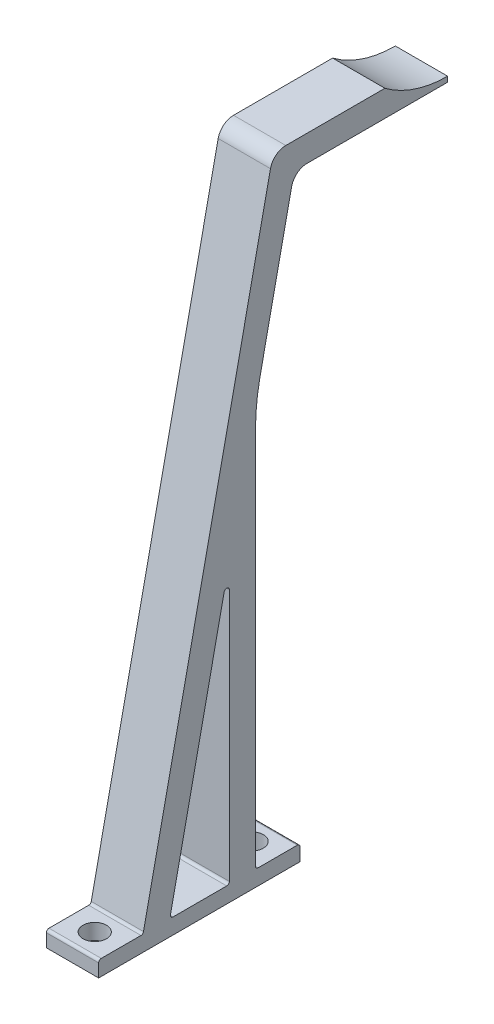
ISO-10303-21;
HEADER;
FILE_DESCRIPTION(('STEP AP214'),'2;1');
FILE_NAME('part.step','',(''),(''),'','','');
FILE_SCHEMA(('AUTOMOTIVE_DESIGN { 1 0 10303 214 1 1 1 1 }'));
ENDSEC;
DATA;
#1=APPLICATION_CONTEXT('core data for automotive mechanical design processes');
#2=APPLICATION_PROTOCOL_DEFINITION('international standard','automotive_design',2000,#1);
#3=PRODUCT_CONTEXT('',#1,'mechanical');
#4=PRODUCT('Part','Part','',(#3));
#5=PRODUCT_RELATED_PRODUCT_CATEGORY('part','',(#4));
#6=PRODUCT_DEFINITION_FORMATION('','',#4);
#7=PRODUCT_DEFINITION_CONTEXT('part definition',#1,'design');
#8=PRODUCT_DEFINITION('design','',#6,#7);
#9=PRODUCT_DEFINITION_SHAPE('','',#8);
#10=(LENGTH_UNIT() NAMED_UNIT(*) SI_UNIT(.MILLI.,.METRE.));
#11=(NAMED_UNIT(*) PLANE_ANGLE_UNIT() SI_UNIT($,.RADIAN.));
#12=(NAMED_UNIT(*) SI_UNIT($,.STERADIAN.) SOLID_ANGLE_UNIT());
#13=UNCERTAINTY_MEASURE_WITH_UNIT(LENGTH_MEASURE(1.E-05),#10,'distance_accuracy_value','');
#14=(GEOMETRIC_REPRESENTATION_CONTEXT(3) GLOBAL_UNCERTAINTY_ASSIGNED_CONTEXT((#13)) GLOBAL_UNIT_ASSIGNED_CONTEXT((#10,
#11,#12)) REPRESENTATION_CONTEXT('',''));
#15=CARTESIAN_POINT('',(0.,0.,0.));
#16=DIRECTION('',(0.,0.,1.));
#17=DIRECTION('',(1.,0.,0.));
#18=AXIS2_PLACEMENT_3D('',#15,#16,#17);
#19=CARTESIAN_POINT('',(10.,104.09497759232,-22.3292773624713));
#20=DIRECTION('',(-1.,0.,0.));
#21=DIRECTION('',(0.,0.,1.));
#22=AXIS2_PLACEMENT_3D('',#19,#20,#21);
#23=PLANE('',#22);
#24=CARTESIAN_POINT('',(10.,104.09497759232,-22.3292773624713));
#25=DIRECTION('',(-1.,0.,0.));
#26=DIRECTION('',(0.,0.,1.));
#27=AXIS2_PLACEMENT_3D('',#24,#25,#26);
#28=CIRCLE('',#27,3.);
#29=CARTESIAN_POINT('',(10.,104.718712664774,-19.3948345602699));
#30=VERTEX_POINT('',#29);
#31=CARTESIAN_POINT('',(10.,107.09497759232,-22.3292773624713));
#32=VERTEX_POINT('',#31);
#33=EDGE_CURVE('E255',#30,#32,#28,.T.);
#34=ORIENTED_EDGE('',*,*,#33,.F.);
#35=DIRECTION('',(0.,-0.978147600733806,0.207911690817756));
#36=VECTOR('',#35,1.);
#37=CARTESIAN_POINT('',(10.,104.718712664774,-19.3948345602699));
#38=LINE('',#37,#36);
#39=CARTESIAN_POINT('',(10.,-9.5089782530885,4.88501066873651));
#40=VERTEX_POINT('',#39);
#41=EDGE_CURVE('E297',#30,#40,#38,.T.);
#42=ORIENTED_EDGE('',*,*,#41,.T.);
#43=CARTESIAN_POINT('',(10.,-9.40502240767963,5.37408446910341));
#44=DIRECTION('',(-1.,0.,0.));
#45=DIRECTION('',(0.,0.,1.));
#46=AXIS2_PLACEMENT_3D('',#43,#44,#45);
#47=CIRCLE('',#46,0.500000000000002);
#48=CARTESIAN_POINT('',(10.,-9.90502240767963,5.37408446910341));
#49=VERTEX_POINT('',#48);
#50=EDGE_CURVE('E295',#40,#49,#47,.T.);
#51=ORIENTED_EDGE('',*,*,#50,.T.);
#52=DIRECTION('',(0.,0.,1.));
#53=VECTOR('',#52,1.);
#54=CARTESIAN_POINT('',(10.,-9.90502240767963,5.37408446910341));
#55=LINE('',#54,#53);
#56=CARTESIAN_POINT('',(10.,-9.90502240767962,12.9691924525059));
#57=VERTEX_POINT('',#56);
#58=EDGE_CURVE('E293',#49,#57,#55,.T.);
#59=ORIENTED_EDGE('',*,*,#58,.T.);
#60=CARTESIAN_POINT('',(10.,-10.4050224076796,12.9691924525059));
#61=DIRECTION('',(1.,0.,0.));
#62=DIRECTION('',(0.,0.,-1.));
#63=AXIS2_PLACEMENT_3D('',#60,#61,#62);
#64=CIRCLE('',#63,0.500000000000001);
#65=CARTESIAN_POINT('',(10.,-10.4050224076796,13.4691924525059));
#66=VERTEX_POINT('',#65);
#67=EDGE_CURVE('E291',#57,#66,#64,.T.);
#68=ORIENTED_EDGE('',*,*,#67,.T.);
#69=DIRECTION('',(0.,-1.,0.));
#70=VECTOR('',#69,1.);
#71=CARTESIAN_POINT('',(10.,-10.4050224076796,13.4691924525059));
#72=LINE('',#71,#70);
#73=CARTESIAN_POINT('',(10.,-12.9050224076796,13.4691924525059));
#74=VERTEX_POINT('',#73);
#75=EDGE_CURVE('E289',#66,#74,#72,.T.);
#76=ORIENTED_EDGE('',*,*,#75,.T.);
#77=DIRECTION('',(0.,0.,-1.));
#78=VECTOR('',#77,1.);
#79=CARTESIAN_POINT('',(10.,-12.9050224076796,13.4691924525059));
#80=LINE('',#79,#78);
#81=CARTESIAN_POINT('',(10.,-12.9050224076796,-25.0308075474941));
#82=VERTEX_POINT('',#81);
#83=EDGE_CURVE('E287',#74,#82,#80,.T.);
#84=ORIENTED_EDGE('',*,*,#83,.T.);
#85=DIRECTION('',(0.,1.,0.));
#86=VECTOR('',#85,1.);
#87=CARTESIAN_POINT('',(10.,-12.9050224076796,-25.0308075474941));
#88=LINE('',#87,#86);
#89=CARTESIAN_POINT('',(10.,-10.4050224076796,-25.0308075474941));
#90=VERTEX_POINT('',#89);
#91=EDGE_CURVE('E285',#82,#90,#88,.T.);
#92=ORIENTED_EDGE('',*,*,#91,.T.);
#93=CARTESIAN_POINT('',(10.,-10.4050224076796,-24.5308075474941));
#94=DIRECTION('',(1.,0.,0.));
#95=DIRECTION('',(0.,0.,-1.));
#96=AXIS2_PLACEMENT_3D('',#93,#94,#95);
#97=CIRCLE('',#96,0.5);
#98=CARTESIAN_POINT('',(10.,-9.90502240767962,-24.5308075474941));
#99=VERTEX_POINT('',#98);
#100=EDGE_CURVE('E283',#90,#99,#97,.T.);
#101=ORIENTED_EDGE('',*,*,#100,.T.);
#102=DIRECTION('',(0.,0.,1.));
#103=VECTOR('',#102,1.);
#104=CARTESIAN_POINT('',(10.,-9.90502240767962,-24.5308075474941));
#105=LINE('',#104,#103);
#106=CARTESIAN_POINT('',(10.,-9.90502240767962,-17.0308075474941));
#107=VERTEX_POINT('',#106);
#108=EDGE_CURVE('E281',#99,#107,#105,.T.);
#109=ORIENTED_EDGE('',*,*,#108,.T.);
#110=CARTESIAN_POINT('',(10.,-9.40502240767962,-17.0308075474941));
#111=DIRECTION('',(-1.,0.,0.));
#112=DIRECTION('',(0.,0.,1.));
#113=AXIS2_PLACEMENT_3D('',#110,#111,#112);
#114=CIRCLE('',#113,0.5);
#115=CARTESIAN_POINT('',(10.,-9.40502240767962,-16.5308075474941));
#116=VERTEX_POINT('',#115);
#117=EDGE_CURVE('E279',#107,#116,#114,.T.);
#118=ORIENTED_EDGE('',*,*,#117,.T.);
#119=DIRECTION('',(0.,1.,0.));
#120=VECTOR('',#119,1.);
#121=CARTESIAN_POINT('',(10.,-9.40502240767962,-16.5308075474941));
#122=LINE('',#121,#120);
#123=CARTESIAN_POINT('',(10.,62.9916838117609,-16.5308075474941));
#124=VERTEX_POINT('',#123);
#125=EDGE_CURVE('E277',#116,#124,#122,.T.);
#126=ORIENTED_EDGE('',*,*,#125,.T.);
#127=CARTESIAN_POINT('',(10.,62.9916838117608,-56.5308075474941));
#128=DIRECTION('',(-1.,0.,0.));
#129=DIRECTION('',(0.,0.,1.));
#130=AXIS2_PLACEMENT_3D('',#127,#128,#129);
#131=CIRCLE('',#130,40.);
#132=CARTESIAN_POINT('',(10.,71.3081514444711,-17.4049035181418));
#133=VERTEX_POINT('',#132);
#134=EDGE_CURVE('E275',#124,#133,#131,.T.);
#135=ORIENTED_EDGE('',*,*,#134,.T.);
#136=DIRECTION('',(0.,0.978147600733806,-0.207911690817756));
#137=VECTOR('',#136,1.);
#138=CARTESIAN_POINT('',(10.,71.3081514444711,-17.4049035181418));
#139=LINE('',#138,#137);
#140=CARTESIAN_POINT('',(10.,99.7187126647736,-23.4437547262449));
#141=VERTEX_POINT('',#140);
#142=EDGE_CURVE('E273',#133,#141,#139,.T.);
#143=ORIENTED_EDGE('',*,*,#142,.T.);
#144=CARTESIAN_POINT('',(10.,99.0949775923204,-26.3781975284463));
#145=DIRECTION('',(1.,0.,0.));
#146=DIRECTION('',(0.,0.,-1.));
#147=AXIS2_PLACEMENT_3D('',#144,#145,#146);
#148=CIRCLE('',#147,3.);
#149=CARTESIAN_POINT('',(10.,102.09497759232,-26.3781975284463));
#150=VERTEX_POINT('',#149);
#151=EDGE_CURVE('E270',#150,#141,#148,.T.);
#152=ORIENTED_EDGE('',*,*,#151,.F.);
#153=DIRECTION('',(0.,0.,1.));
#154=VECTOR('',#153,1.);
#155=CARTESIAN_POINT('',(10.,102.09497759232,-53.2808075474941));
#156=LINE('',#155,#154);
#157=CARTESIAN_POINT('',(10.,102.09497759232,-53.2808075474941));
#158=VERTEX_POINT('',#157);
#159=EDGE_CURVE('E267',#158,#150,#156,.T.);
#160=ORIENTED_EDGE('',*,*,#159,.F.);
#161=DIRECTION('',(0.,-1.,0.));
#162=VECTOR('',#161,1.);
#163=CARTESIAN_POINT('',(10.,103.09497759232,-53.2808075474941));
#164=LINE('',#163,#162);
#165=CARTESIAN_POINT('',(10.,103.09497759232,-53.2808075474941));
#166=VERTEX_POINT('',#165);
#167=EDGE_CURVE('E264',#166,#158,#164,.T.);
#168=ORIENTED_EDGE('',*,*,#167,.F.);
#169=CARTESIAN_POINT('',(10.,123.09497759232,-53.2808075474941));
#170=DIRECTION('',(-1.,0.,0.));
#171=DIRECTION('',(0.,0.,1.));
#172=AXIS2_PLACEMENT_3D('',#169,#170,#171);
#173=CIRCLE('',#172,20.);
#174=CARTESIAN_POINT('',(10.,107.09497759232,-41.2808075474941));
#175=VERTEX_POINT('',#174);
#176=EDGE_CURVE('E262',#166,#175,#173,.T.);
#177=ORIENTED_EDGE('',*,*,#176,.T.);
#178=DIRECTION('',(0.,0.,-1.));
#179=VECTOR('',#178,1.);
#180=CARTESIAN_POINT('',(10.,107.09497759232,-22.3292773624713));
#181=LINE('',#180,#179);
#182=EDGE_CURVE('E258',#32,#175,#181,.T.);
#183=ORIENTED_EDGE('',*,*,#182,.F.);
#184=EDGE_LOOP('',(#34,#42,#51,#59,#68,#76,#84,#92,#101,#109,#118,#126,#135,#143,#152,#160,#168,
#177,#183));
#185=FACE_BOUND('',#184,.T.);
#186=CARTESIAN_POINT('',(10.,-9.40502240767963,-0.759959100086765));
#187=DIRECTION('',(1.,0.,0.));
#188=DIRECTION('',(0.,0.,1.));
#189=AXIS2_PLACEMENT_3D('',#186,#187,#188);
#190=CIRCLE('',#189,0.5);
#191=CARTESIAN_POINT('',(10.,-9.30106656227075,-0.270885299719861));
#192=VERTEX_POINT('',#191);
#193=CARTESIAN_POINT('',(10.,-9.90502240767963,-0.759959100086765));
#194=VERTEX_POINT('',#193);
#195=EDGE_CURVE('E202',#192,#194,#190,.T.);
#196=ORIENTED_EDGE('',*,*,#195,.F.);
#197=DIRECTION('',(0.,-0.978147600733806,0.207911690817756));
#198=VECTOR('',#197,1.);
#199=CARTESIAN_POINT('',(10.,39.0194762932927,-10.5417337471272));
#200=LINE('',#199,#198);
#201=CARTESIAN_POINT('',(10.,39.0194762932927,-10.5417337471272));
#202=VERTEX_POINT('',#201);
#203=EDGE_CURVE('E232',#202,#192,#200,.T.);
#204=ORIENTED_EDGE('',*,*,#203,.F.);
#205=CARTESIAN_POINT('',(10.,38.9155204478838,-11.0308075474941));
#206=DIRECTION('',(1.,0.,0.));
#207=DIRECTION('',(0.,0.,-1.));
#208=AXIS2_PLACEMENT_3D('',#205,#206,#207);
#209=CIRCLE('',#208,0.500000000000002);
#210=CARTESIAN_POINT('',(10.,38.9155204478838,-11.5308075474941));
#211=VERTEX_POINT('',#210);
#212=EDGE_CURVE('E230',#211,#202,#209,.T.);
#213=ORIENTED_EDGE('',*,*,#212,.F.);
#214=DIRECTION('',(0.,1.,0.));
#215=VECTOR('',#214,1.);
#216=CARTESIAN_POINT('',(10.,-9.40502240767963,-11.5308075474941));
#217=LINE('',#216,#215);
#218=CARTESIAN_POINT('',(10.,-9.40502240767963,-11.5308075474941));
#219=VERTEX_POINT('',#218);
#220=EDGE_CURVE('E225',#219,#211,#217,.T.);
#221=ORIENTED_EDGE('',*,*,#220,.F.);
#222=CARTESIAN_POINT('',(10.,-9.40502240767963,-11.0308075474941));
#223=DIRECTION('',(1.,0.,0.));
#224=DIRECTION('',(0.,0.,-1.));
#225=AXIS2_PLACEMENT_3D('',#222,#223,#224);
#226=CIRCLE('',#225,0.5);
#227=CARTESIAN_POINT('',(10.,-9.90502240767963,-11.0308075474941));
#228=VERTEX_POINT('',#227);
#229=EDGE_CURVE('E223',#228,#219,#226,.T.);
#230=ORIENTED_EDGE('',*,*,#229,.F.);
#231=DIRECTION('',(0.,0.,-1.));
#232=VECTOR('',#231,1.);
#233=CARTESIAN_POINT('',(10.,-9.90502240767963,-0.759959100086765));
#234=LINE('',#233,#232);
#235=EDGE_CURVE('E210',#194,#228,#234,.T.);
#236=ORIENTED_EDGE('',*,*,#235,.F.);
#237=EDGE_LOOP('',(#196,#204,#213,#221,#230,#236));
#238=FACE_BOUND('',#237,.T.);
#239=ADVANCED_FACE('F34',(#185,#238),#23,.F.);
#240=CARTESIAN_POINT('',(0.,104.09497759232,-22.3292773624713));
#241=DIRECTION('',(-1.,0.,0.));
#242=DIRECTION('',(0.,0.,1.));
#243=AXIS2_PLACEMENT_3D('',#240,#241,#242);
#244=PLANE('',#243);
#245=CARTESIAN_POINT('',(0.,104.09497759232,-22.3292773624713));
#246=DIRECTION('',(-1.,0.,0.));
#247=DIRECTION('',(0.,0.,1.));
#248=AXIS2_PLACEMENT_3D('',#245,#246,#247);
#249=CIRCLE('',#248,3.);
#250=CARTESIAN_POINT('',(0.,104.718712664774,-19.3948345602699));
#251=VERTEX_POINT('',#250);
#252=CARTESIAN_POINT('',(0.,107.09497759232,-22.3292773624713));
#253=VERTEX_POINT('',#252);
#254=EDGE_CURVE('E218',#251,#253,#249,.T.);
#255=ORIENTED_EDGE('',*,*,#254,.T.);
#256=DIRECTION('',(0.,0.,-1.));
#257=VECTOR('',#256,1.);
#258=CARTESIAN_POINT('',(0.,107.09497759232,-22.3292773624713));
#259=LINE('',#258,#257);
#260=CARTESIAN_POINT('',(0.,107.09497759232,-41.2808075474941));
#261=VERTEX_POINT('',#260);
#262=EDGE_CURVE('E302',#253,#261,#259,.T.);
#263=ORIENTED_EDGE('',*,*,#262,.T.);
#264=CARTESIAN_POINT('',(0.,123.09497759232,-53.2808075474941));
#265=DIRECTION('',(-1.,0.,0.));
#266=DIRECTION('',(0.,0.,1.));
#267=AXIS2_PLACEMENT_3D('',#264,#265,#266);
#268=CIRCLE('',#267,20.);
#269=CARTESIAN_POINT('',(0.,103.09497759232,-53.2808075474941));
#270=VERTEX_POINT('',#269);
#271=EDGE_CURVE('E305',#270,#261,#268,.T.);
#272=ORIENTED_EDGE('',*,*,#271,.F.);
#273=DIRECTION('',(0.,-1.,0.));
#274=VECTOR('',#273,1.);
#275=CARTESIAN_POINT('',(0.,103.09497759232,-53.2808075474941));
#276=LINE('',#275,#274);
#277=CARTESIAN_POINT('',(0.,102.09497759232,-53.2808075474941));
#278=VERTEX_POINT('',#277);
#279=EDGE_CURVE('E308',#270,#278,#276,.T.);
#280=ORIENTED_EDGE('',*,*,#279,.T.);
#281=DIRECTION('',(0.,0.,1.));
#282=VECTOR('',#281,1.);
#283=CARTESIAN_POINT('',(0.,102.09497759232,-53.2808075474941));
#284=LINE('',#283,#282);
#285=CARTESIAN_POINT('',(0.,102.09497759232,-26.3781975284463));
#286=VERTEX_POINT('',#285);
#287=EDGE_CURVE('E311',#278,#286,#284,.T.);
#288=ORIENTED_EDGE('',*,*,#287,.T.);
#289=CARTESIAN_POINT('',(0.,99.0949775923204,-26.3781975284463));
#290=DIRECTION('',(1.,0.,0.));
#291=DIRECTION('',(0.,0.,-1.));
#292=AXIS2_PLACEMENT_3D('',#289,#290,#291);
#293=CIRCLE('',#292,3.);
#294=CARTESIAN_POINT('',(0.,99.7187126647736,-23.4437547262449));
#295=VERTEX_POINT('',#294);
#296=EDGE_CURVE('E314',#286,#295,#293,.T.);
#297=ORIENTED_EDGE('',*,*,#296,.T.);
#298=DIRECTION('',(0.,0.978147600733806,-0.207911690817756));
#299=VECTOR('',#298,1.);
#300=CARTESIAN_POINT('',(0.,71.3081514444711,-17.4049035181418));
#301=LINE('',#300,#299);
#302=CARTESIAN_POINT('',(0.,71.3081514444711,-17.4049035181418));
#303=VERTEX_POINT('',#302);
#304=EDGE_CURVE('E317',#303,#295,#301,.T.);
#305=ORIENTED_EDGE('',*,*,#304,.F.);
#306=CARTESIAN_POINT('',(0.,62.9916838117608,-56.5308075474941));
#307=DIRECTION('',(-1.,0.,0.));
#308=DIRECTION('',(0.,0.,1.));
#309=AXIS2_PLACEMENT_3D('',#306,#307,#308);
#310=CIRCLE('',#309,40.);
#311=CARTESIAN_POINT('',(0.,62.9916838117609,-16.5308075474941));
#312=VERTEX_POINT('',#311);
#313=EDGE_CURVE('E320',#312,#303,#310,.T.);
#314=ORIENTED_EDGE('',*,*,#313,.F.);
#315=DIRECTION('',(0.,1.,0.));
#316=VECTOR('',#315,1.);
#317=CARTESIAN_POINT('',(0.,-9.40502240767962,-16.5308075474941));
#318=LINE('',#317,#316);
#319=CARTESIAN_POINT('',(0.,-9.40502240767962,-16.5308075474941));
#320=VERTEX_POINT('',#319);
#321=EDGE_CURVE('E322',#320,#312,#318,.T.);
#322=ORIENTED_EDGE('',*,*,#321,.F.);
#323=CARTESIAN_POINT('',(0.,-9.40502240767962,-17.0308075474941));
#324=DIRECTION('',(-1.,0.,0.));
#325=DIRECTION('',(0.,0.,1.));
#326=AXIS2_PLACEMENT_3D('',#323,#324,#325);
#327=CIRCLE('',#326,0.5);
#328=CARTESIAN_POINT('',(0.,-9.90502240767962,-17.0308075474941));
#329=VERTEX_POINT('',#328);
#330=EDGE_CURVE('E324',#329,#320,#327,.T.);
#331=ORIENTED_EDGE('',*,*,#330,.F.);
#332=DIRECTION('',(0.,0.,1.));
#333=VECTOR('',#332,1.);
#334=CARTESIAN_POINT('',(0.,-9.90502240767962,-24.5308075474941));
#335=LINE('',#334,#333);
#336=CARTESIAN_POINT('',(0.,-9.90502240767962,-24.5308075474941));
#337=VERTEX_POINT('',#336);
#338=EDGE_CURVE('E326',#337,#329,#335,.T.);
#339=ORIENTED_EDGE('',*,*,#338,.F.);
#340=CARTESIAN_POINT('',(0.,-10.4050224076796,-24.5308075474941));
#341=DIRECTION('',(1.,0.,0.));
#342=DIRECTION('',(0.,0.,-1.));
#343=AXIS2_PLACEMENT_3D('',#340,#341,#342);
#344=CIRCLE('',#343,0.5);
#345=CARTESIAN_POINT('',(0.,-10.4050224076796,-25.0308075474941));
#346=VERTEX_POINT('',#345);
#347=EDGE_CURVE('E328',#346,#337,#344,.T.);
#348=ORIENTED_EDGE('',*,*,#347,.F.);
#349=DIRECTION('',(0.,1.,0.));
#350=VECTOR('',#349,1.);
#351=CARTESIAN_POINT('',(0.,-12.9050224076796,-25.0308075474941));
#352=LINE('',#351,#350);
#353=CARTESIAN_POINT('',(0.,-12.9050224076796,-25.0308075474941));
#354=VERTEX_POINT('',#353);
#355=EDGE_CURVE('E330',#354,#346,#352,.T.);
#356=ORIENTED_EDGE('',*,*,#355,.F.);
#357=DIRECTION('',(0.,0.,-1.));
#358=VECTOR('',#357,1.);
#359=CARTESIAN_POINT('',(0.,-12.9050224076796,13.4691924525059));
#360=LINE('',#359,#358);
#361=CARTESIAN_POINT('',(0.,-12.9050224076796,13.4691924525059));
#362=VERTEX_POINT('',#361);
#363=EDGE_CURVE('E332',#362,#354,#360,.T.);
#364=ORIENTED_EDGE('',*,*,#363,.F.);
#365=DIRECTION('',(0.,-1.,0.));
#366=VECTOR('',#365,1.);
#367=CARTESIAN_POINT('',(0.,-10.4050224076796,13.4691924525059));
#368=LINE('',#367,#366);
#369=CARTESIAN_POINT('',(0.,-10.4050224076796,13.4691924525059));
#370=VERTEX_POINT('',#369);
#371=EDGE_CURVE('E334',#370,#362,#368,.T.);
#372=ORIENTED_EDGE('',*,*,#371,.F.);
#373=CARTESIAN_POINT('',(0.,-10.4050224076796,12.9691924525059));
#374=DIRECTION('',(1.,0.,0.));
#375=DIRECTION('',(0.,0.,-1.));
#376=AXIS2_PLACEMENT_3D('',#373,#374,#375);
#377=CIRCLE('',#376,0.500000000000001);
#378=CARTESIAN_POINT('',(0.,-9.90502240767962,12.9691924525059));
#379=VERTEX_POINT('',#378);
#380=EDGE_CURVE('E336',#379,#370,#377,.T.);
#381=ORIENTED_EDGE('',*,*,#380,.F.);
#382=DIRECTION('',(0.,0.,1.));
#383=VECTOR('',#382,1.);
#384=CARTESIAN_POINT('',(0.,-9.90502240767963,5.37408446910341));
#385=LINE('',#384,#383);
#386=CARTESIAN_POINT('',(0.,-9.90502240767963,5.37408446910341));
#387=VERTEX_POINT('',#386);
#388=EDGE_CURVE('E338',#387,#379,#385,.T.);
#389=ORIENTED_EDGE('',*,*,#388,.F.);
#390=CARTESIAN_POINT('',(0.,-9.40502240767963,5.37408446910341));
#391=DIRECTION('',(-1.,0.,0.));
#392=DIRECTION('',(0.,0.,1.));
#393=AXIS2_PLACEMENT_3D('',#390,#391,#392);
#394=CIRCLE('',#393,0.500000000000002);
#395=CARTESIAN_POINT('',(0.,-9.5089782530885,4.88501066873651));
#396=VERTEX_POINT('',#395);
#397=EDGE_CURVE('E340',#396,#387,#394,.T.);
#398=ORIENTED_EDGE('',*,*,#397,.F.);
#399=DIRECTION('',(0.,-0.978147600733806,0.207911690817756));
#400=VECTOR('',#399,1.);
#401=CARTESIAN_POINT('',(0.,104.718712664774,-19.3948345602699));
#402=LINE('',#401,#400);
#403=EDGE_CURVE('E259',#251,#396,#402,.T.);
#404=ORIENTED_EDGE('',*,*,#403,.F.);
#405=EDGE_LOOP('',(#255,#263,#272,#280,#288,#297,#305,#314,#322,#331,#339,#348,#356,#364,#372,
#381,#389,#398,#404));
#406=FACE_BOUND('',#405,.T.);
#407=DIRECTION('',(0.,-0.978147600733806,0.207911690817756));
#408=VECTOR('',#407,1.);
#409=CARTESIAN_POINT('',(0.,39.0194762932927,-10.5417337471272));
#410=LINE('',#409,#408);
#411=CARTESIAN_POINT('',(0.,39.0194762932927,-10.5417337471272));
#412=VERTEX_POINT('',#411);
#413=CARTESIAN_POINT('',(0.,-9.30106656227073,-0.270885299719865));
#414=VERTEX_POINT('',#413);
#415=EDGE_CURVE('E211',#412,#414,#410,.T.);
#416=ORIENTED_EDGE('',*,*,#415,.T.);
#417=CARTESIAN_POINT('',(0.,-9.40502240767963,-0.759959100086765));
#418=DIRECTION('',(1.,0.,0.));
#419=DIRECTION('',(0.,0.,1.));
#420=AXIS2_PLACEMENT_3D('',#417,#418,#419);
#421=CIRCLE('',#420,0.5);
#422=CARTESIAN_POINT('',(0.,-9.90502240767963,-0.759959100086765));
#423=VERTEX_POINT('',#422);
#424=EDGE_CURVE('E59',#414,#423,#421,.T.);
#425=ORIENTED_EDGE('',*,*,#424,.T.);
#426=DIRECTION('',(0.,0.,-1.));
#427=VECTOR('',#426,1.);
#428=CARTESIAN_POINT('',(0.,-9.90502240767963,-0.759959100086765));
#429=LINE('',#428,#427);
#430=CARTESIAN_POINT('',(0.,-9.90502240767963,-11.0308075474941));
#431=VERTEX_POINT('',#430);
#432=EDGE_CURVE('E217',#423,#431,#429,.T.);
#433=ORIENTED_EDGE('',*,*,#432,.T.);
#434=CARTESIAN_POINT('',(0.,-9.40502240767963,-11.0308075474941));
#435=DIRECTION('',(1.,0.,0.));
#436=DIRECTION('',(0.,0.,-1.));
#437=AXIS2_PLACEMENT_3D('',#434,#435,#436);
#438=CIRCLE('',#437,0.5);
#439=CARTESIAN_POINT('',(0.,-9.40502240767963,-11.5308075474941));
#440=VERTEX_POINT('',#439);
#441=EDGE_CURVE('E237',#431,#440,#438,.T.);
#442=ORIENTED_EDGE('',*,*,#441,.T.);
#443=DIRECTION('',(0.,1.,0.));
#444=VECTOR('',#443,1.);
#445=CARTESIAN_POINT('',(0.,-9.40502240767963,-11.5308075474941));
#446=LINE('',#445,#444);
#447=CARTESIAN_POINT('',(0.,38.9155204478838,-11.5308075474941));
#448=VERTEX_POINT('',#447);
#449=EDGE_CURVE('E240',#440,#448,#446,.T.);
#450=ORIENTED_EDGE('',*,*,#449,.T.);
#451=CARTESIAN_POINT('',(0.,38.9155204478838,-11.0308075474941));
#452=DIRECTION('',(1.,0.,0.));
#453=DIRECTION('',(0.,0.,-1.));
#454=AXIS2_PLACEMENT_3D('',#451,#452,#453);
#455=CIRCLE('',#454,0.500000000000002);
#456=EDGE_CURVE('E243',#448,#412,#455,.T.);
#457=ORIENTED_EDGE('',*,*,#456,.T.);
#458=EDGE_LOOP('',(#416,#425,#433,#442,#450,#457));
#459=FACE_BOUND('',#458,.T.);
#460=ADVANCED_FACE('F398',(#406,#459),#244,.T.);
#461=CARTESIAN_POINT('',(10.,104.09497759232,-22.3292773624713));
#462=DIRECTION('',(-1.,0.,0.));
#463=DIRECTION('',(0.,0.,1.));
#464=AXIS2_PLACEMENT_3D('',#461,#462,#463);
#465=CYLINDRICAL_SURFACE('',#464,3.);
#466=ORIENTED_EDGE('',*,*,#254,.F.);
#467=DIRECTION('',(-1.,0.,0.));
#468=VECTOR('',#467,1.);
#469=CARTESIAN_POINT('',(10.,104.718712664774,-19.3948345602699));
#470=LINE('',#469,#468);
#471=EDGE_CURVE('E12',#30,#251,#470,.T.);
#472=ORIENTED_EDGE('',*,*,#471,.F.);
#473=ORIENTED_EDGE('',*,*,#33,.T.);
#474=DIRECTION('',(-1.,0.,0.));
#475=VECTOR('',#474,1.);
#476=CARTESIAN_POINT('',(10.,107.09497759232,-22.3292773624713));
#477=LINE('',#476,#475);
#478=EDGE_CURVE('E299',#32,#253,#477,.T.);
#479=ORIENTED_EDGE('',*,*,#478,.T.);
#480=EDGE_LOOP('',(#466,#472,#473,#479));
#481=FACE_BOUND('',#480,.T.);
#482=ADVANCED_FACE('F36',(#481),#465,.T.);
#483=CARTESIAN_POINT('',(10.,104.718712664774,-19.3948345602699));
#484=DIRECTION('',(0.,-0.207911690817756,-0.978147600733806));
#485=DIRECTION('',(0.,0.978147600733806,-0.207911690817756));
#486=AXIS2_PLACEMENT_3D('',#483,#484,#485);
#487=PLANE('',#486);
#488=ORIENTED_EDGE('',*,*,#403,.T.);
#489=DIRECTION('',(-1.,0.,0.));
#490=VECTOR('',#489,1.);
#491=CARTESIAN_POINT('',(10.,-9.5089782530885,4.88501066873651));
#492=LINE('',#491,#490);
#493=EDGE_CURVE('E43',#40,#396,#492,.T.);
#494=ORIENTED_EDGE('',*,*,#493,.F.);
#495=ORIENTED_EDGE('',*,*,#41,.F.);
#496=ORIENTED_EDGE('',*,*,#471,.T.);
#497=EDGE_LOOP('',(#488,#494,#495,#496));
#498=FACE_BOUND('',#497,.T.);
#499=ADVANCED_FACE('F404',(#498),#487,.F.);
#500=CARTESIAN_POINT('',(10.,-9.40502240767963,5.37408446910341));
#501=DIRECTION('',(-1.,0.,0.));
#502=DIRECTION('',(0.,0.,1.));
#503=AXIS2_PLACEMENT_3D('',#500,#501,#502);
#504=CYLINDRICAL_SURFACE('',#503,0.500000000000002);
#505=ORIENTED_EDGE('',*,*,#397,.T.);
#506=DIRECTION('',(-1.,0.,0.));
#507=VECTOR('',#506,1.);
#508=CARTESIAN_POINT('',(10.,-9.90502240767963,5.37408446910341));
#509=LINE('',#508,#507);
#510=EDGE_CURVE('E345',#49,#387,#509,.T.);
#511=ORIENTED_EDGE('',*,*,#510,.F.);
#512=ORIENTED_EDGE('',*,*,#50,.F.);
#513=ORIENTED_EDGE('',*,*,#493,.T.);
#514=EDGE_LOOP('',(#505,#511,#512,#513));
#515=FACE_BOUND('',#514,.T.);
#516=ADVANCED_FACE('F408',(#515),#504,.F.);
#517=CARTESIAN_POINT('',(10.,-9.90502240767963,5.37408446910341));
#518=DIRECTION('',(0.,-1.,0.));
#519=DIRECTION('',(0.,0.,-1.));
#520=AXIS2_PLACEMENT_3D('',#517,#518,#519);
#521=PLANE('',#520);
#522=CARTESIAN_POINT('',(5.,-9.90502240767963,9.2191924525059));
#523=DIRECTION('',(0.,-1.,0.));
#524=DIRECTION('',(0.,0.,-1.));
#525=AXIS2_PLACEMENT_3D('',#522,#523,#524);
#526=CIRCLE('',#525,2.25);
#527=CARTESIAN_POINT('',(5.,-9.90502240767963,6.9691924525059));
#528=VERTEX_POINT('',#527);
#529=EDGE_CURVE('E235',#528,#528,#526,.T.);
#530=ORIENTED_EDGE('',*,*,#529,.T.);
#531=EDGE_LOOP('',(#530));
#532=FACE_BOUND('',#531,.T.);
#533=ORIENTED_EDGE('',*,*,#388,.T.);
#534=DIRECTION('',(-1.,0.,0.));
#535=VECTOR('',#534,1.);
#536=CARTESIAN_POINT('',(10.,-9.90502240767962,12.9691924525059));
#537=LINE('',#536,#535);
#538=EDGE_CURVE('E348',#57,#379,#537,.T.);
#539=ORIENTED_EDGE('',*,*,#538,.F.);
#540=ORIENTED_EDGE('',*,*,#58,.F.);
#541=ORIENTED_EDGE('',*,*,#510,.T.);
#542=EDGE_LOOP('',(#533,#539,#540,#541));
#543=FACE_BOUND('',#542,.T.);
#544=ADVANCED_FACE('F479',(#532,#543),#521,.F.);
#545=CARTESIAN_POINT('',(10.,-10.4050224076796,12.9691924525059));
#546=DIRECTION('',(-1.,0.,0.));
#547=DIRECTION('',(0.,0.,1.));
#548=AXIS2_PLACEMENT_3D('',#545,#546,#547);
#549=CYLINDRICAL_SURFACE('',#548,0.500000000000001);
#550=ORIENTED_EDGE('',*,*,#380,.T.);
#551=DIRECTION('',(-1.,0.,0.));
#552=VECTOR('',#551,1.);
#553=CARTESIAN_POINT('',(10.,-10.4050224076796,13.4691924525059));
#554=LINE('',#553,#552);
#555=EDGE_CURVE('E351',#66,#370,#554,.T.);
#556=ORIENTED_EDGE('',*,*,#555,.F.);
#557=ORIENTED_EDGE('',*,*,#67,.F.);
#558=ORIENTED_EDGE('',*,*,#538,.T.);
#559=EDGE_LOOP('',(#550,#556,#557,#558));
#560=FACE_BOUND('',#559,.T.);
#561=ADVANCED_FACE('F477',(#560),#549,.T.);
#562=CARTESIAN_POINT('',(10.,-10.4050224076796,13.4691924525059));
#563=DIRECTION('',(0.,0.,-1.));
#564=DIRECTION('',(-1.,0.,0.));
#565=AXIS2_PLACEMENT_3D('',#562,#563,#564);
#566=PLANE('',#565);
#567=ORIENTED_EDGE('',*,*,#371,.T.);
#568=DIRECTION('',(-1.,0.,0.));
#569=VECTOR('',#568,1.);
#570=CARTESIAN_POINT('',(10.,-12.9050224076796,13.4691924525059));
#571=LINE('',#570,#569);
#572=EDGE_CURVE('E354',#74,#362,#571,.T.);
#573=ORIENTED_EDGE('',*,*,#572,.F.);
#574=ORIENTED_EDGE('',*,*,#75,.F.);
#575=ORIENTED_EDGE('',*,*,#555,.T.);
#576=EDGE_LOOP('',(#567,#573,#574,#575));
#577=FACE_BOUND('',#576,.T.);
#578=ADVANCED_FACE('F472',(#577),#566,.F.);
#579=CARTESIAN_POINT('',(10.,-12.9050224076796,13.4691924525059));
#580=DIRECTION('',(0.,1.,0.));
#581=DIRECTION('',(0.,0.,1.));
#582=AXIS2_PLACEMENT_3D('',#579,#580,#581);
#583=PLANE('',#582);
#584=CARTESIAN_POINT('',(5.,-12.9050224076796,-20.7808075474941));
#585=DIRECTION('',(0.,-1.,0.));
#586=DIRECTION('',(0.,0.,-1.));
#587=AXIS2_PLACEMENT_3D('',#584,#585,#586);
#588=CIRCLE('',#587,2.25);
#589=CARTESIAN_POINT('',(5.,-12.9050224076796,-23.0308075474941));
#590=VERTEX_POINT('',#589);
#591=EDGE_CURVE('E626',#590,#590,#588,.T.);
#592=ORIENTED_EDGE('',*,*,#591,.F.);
#593=EDGE_LOOP('',(#592));
#594=FACE_BOUND('',#593,.T.);
#595=CARTESIAN_POINT('',(5.,-12.9050224076796,9.2191924525059));
#596=DIRECTION('',(0.,-1.,0.));
#597=DIRECTION('',(0.,0.,-1.));
#598=AXIS2_PLACEMENT_3D('',#595,#596,#597);
#599=CIRCLE('',#598,2.25);
#600=CARTESIAN_POINT('',(5.,-12.9050224076796,6.9691924525059));
#601=VERTEX_POINT('',#600);
#602=EDGE_CURVE('E629',#601,#601,#599,.T.);
#603=ORIENTED_EDGE('',*,*,#602,.F.);
#604=EDGE_LOOP('',(#603));
#605=FACE_BOUND('',#604,.T.);
#606=ORIENTED_EDGE('',*,*,#363,.T.);
#607=DIRECTION('',(-1.,0.,0.));
#608=VECTOR('',#607,1.);
#609=CARTESIAN_POINT('',(10.,-12.9050224076796,-25.0308075474941));
#610=LINE('',#609,#608);
#611=EDGE_CURVE('E357',#82,#354,#610,.T.);
#612=ORIENTED_EDGE('',*,*,#611,.F.);
#613=ORIENTED_EDGE('',*,*,#83,.F.);
#614=ORIENTED_EDGE('',*,*,#572,.T.);
#615=EDGE_LOOP('',(#606,#612,#613,#614));
#616=FACE_BOUND('',#615,.T.);
#617=ADVANCED_FACE('F467',(#594,#605,#616),#583,.F.);
#618=CARTESIAN_POINT('',(10.,-12.9050224076796,-25.0308075474941));
#619=DIRECTION('',(0.,0.,1.));
#620=DIRECTION('',(0.,-1.,0.));
#621=AXIS2_PLACEMENT_3D('',#618,#619,#620);
#622=PLANE('',#621);
#623=ORIENTED_EDGE('',*,*,#355,.T.);
#624=DIRECTION('',(-1.,0.,0.));
#625=VECTOR('',#624,1.);
#626=CARTESIAN_POINT('',(10.,-10.4050224076796,-25.0308075474941));
#627=LINE('',#626,#625);
#628=EDGE_CURVE('E360',#90,#346,#627,.T.);
#629=ORIENTED_EDGE('',*,*,#628,.F.);
#630=ORIENTED_EDGE('',*,*,#91,.F.);
#631=ORIENTED_EDGE('',*,*,#611,.T.);
#632=EDGE_LOOP('',(#623,#629,#630,#631));
#633=FACE_BOUND('',#632,.T.);
#634=ADVANCED_FACE('F463',(#633),#622,.F.);
#635=CARTESIAN_POINT('',(10.,-10.4050224076796,-24.5308075474941));
#636=DIRECTION('',(-1.,0.,0.));
#637=DIRECTION('',(0.,0.,1.));
#638=AXIS2_PLACEMENT_3D('',#635,#636,#637);
#639=CYLINDRICAL_SURFACE('',#638,0.5);
#640=ORIENTED_EDGE('',*,*,#347,.T.);
#641=DIRECTION('',(-1.,0.,0.));
#642=VECTOR('',#641,1.);
#643=CARTESIAN_POINT('',(10.,-9.90502240767962,-24.5308075474941));
#644=LINE('',#643,#642);
#645=EDGE_CURVE('E363',#99,#337,#644,.T.);
#646=ORIENTED_EDGE('',*,*,#645,.F.);
#647=ORIENTED_EDGE('',*,*,#100,.F.);
#648=ORIENTED_EDGE('',*,*,#628,.T.);
#649=EDGE_LOOP('',(#640,#646,#647,#648));
#650=FACE_BOUND('',#649,.T.);
#651=ADVANCED_FACE('F458',(#650),#639,.T.);
#652=CARTESIAN_POINT('',(10.,-9.90502240767962,-24.5308075474941));
#653=DIRECTION('',(0.,-1.,0.));
#654=DIRECTION('',(0.,0.,-1.));
#655=AXIS2_PLACEMENT_3D('',#652,#653,#654);
#656=PLANE('',#655);
#657=CARTESIAN_POINT('',(5.,-9.90502240767962,-20.7808075474941));
#658=DIRECTION('',(0.,-1.,0.));
#659=DIRECTION('',(0.,0.,-1.));
#660=AXIS2_PLACEMENT_3D('',#657,#658,#659);
#661=CIRCLE('',#660,2.25);
#662=CARTESIAN_POINT('',(5.,-9.90502240767962,-23.0308075474941));
#663=VERTEX_POINT('',#662);
#664=EDGE_CURVE('E38',#663,#663,#661,.T.);
#665=ORIENTED_EDGE('',*,*,#664,.T.);
#666=EDGE_LOOP('',(#665));
#667=FACE_BOUND('',#666,.T.);
#668=ORIENTED_EDGE('',*,*,#338,.T.);
#669=DIRECTION('',(-1.,0.,0.));
#670=VECTOR('',#669,1.);
#671=CARTESIAN_POINT('',(10.,-9.90502240767962,-17.0308075474941));
#672=LINE('',#671,#670);
#673=EDGE_CURVE('E366',#107,#329,#672,.T.);
#674=ORIENTED_EDGE('',*,*,#673,.F.);
#675=ORIENTED_EDGE('',*,*,#108,.F.);
#676=ORIENTED_EDGE('',*,*,#645,.T.);
#677=EDGE_LOOP('',(#668,#674,#675,#676));
#678=FACE_BOUND('',#677,.T.);
#679=ADVANCED_FACE('F452',(#667,#678),#656,.F.);
#680=CARTESIAN_POINT('',(10.,-9.40502240767962,-17.0308075474941));
#681=DIRECTION('',(-1.,0.,0.));
#682=DIRECTION('',(0.,0.,1.));
#683=AXIS2_PLACEMENT_3D('',#680,#681,#682);
#684=CYLINDRICAL_SURFACE('',#683,0.5);
#685=ORIENTED_EDGE('',*,*,#330,.T.);
#686=DIRECTION('',(-1.,0.,0.));
#687=VECTOR('',#686,1.);
#688=CARTESIAN_POINT('',(10.,-9.40502240767962,-16.5308075474941));
#689=LINE('',#688,#687);
#690=EDGE_CURVE('E369',#116,#320,#689,.T.);
#691=ORIENTED_EDGE('',*,*,#690,.F.);
#692=ORIENTED_EDGE('',*,*,#117,.F.);
#693=ORIENTED_EDGE('',*,*,#673,.T.);
#694=EDGE_LOOP('',(#685,#691,#692,#693));
#695=FACE_BOUND('',#694,.T.);
#696=ADVANCED_FACE('F448',(#695),#684,.F.);
#697=CARTESIAN_POINT('',(10.,-9.40502240767962,-16.5308075474941));
#698=DIRECTION('',(0.,0.,1.));
#699=DIRECTION('',(0.,-1.,0.));
#700=AXIS2_PLACEMENT_3D('',#697,#698,#699);
#701=PLANE('',#700);
#702=ORIENTED_EDGE('',*,*,#321,.T.);
#703=DIRECTION('',(-1.,0.,0.));
#704=VECTOR('',#703,1.);
#705=CARTESIAN_POINT('',(10.,62.9916838117609,-16.5308075474941));
#706=LINE('',#705,#704);
#707=EDGE_CURVE('E372',#124,#312,#706,.T.);
#708=ORIENTED_EDGE('',*,*,#707,.F.);
#709=ORIENTED_EDGE('',*,*,#125,.F.);
#710=ORIENTED_EDGE('',*,*,#690,.T.);
#711=EDGE_LOOP('',(#702,#708,#709,#710));
#712=FACE_BOUND('',#711,.T.);
#713=ADVANCED_FACE('F443',(#712),#701,.F.);
#714=CARTESIAN_POINT('',(10.,62.9916838117608,-56.5308075474941));
#715=DIRECTION('',(-1.,0.,0.));
#716=DIRECTION('',(0.,0.,1.));
#717=AXIS2_PLACEMENT_3D('',#714,#715,#716);
#718=CYLINDRICAL_SURFACE('',#717,40.);
#719=ORIENTED_EDGE('',*,*,#313,.T.);
#720=DIRECTION('',(-1.,0.,0.));
#721=VECTOR('',#720,1.);
#722=CARTESIAN_POINT('',(10.,71.3081514444711,-17.4049035181418));
#723=LINE('',#722,#721);
#724=EDGE_CURVE('E375',#133,#303,#723,.T.);
#725=ORIENTED_EDGE('',*,*,#724,.F.);
#726=ORIENTED_EDGE('',*,*,#134,.F.);
#727=ORIENTED_EDGE('',*,*,#707,.T.);
#728=EDGE_LOOP('',(#719,#725,#726,#727));
#729=FACE_BOUND('',#728,.T.);
#730=ADVANCED_FACE('F437',(#729),#718,.F.);
#731=CARTESIAN_POINT('',(10.,71.3081514444711,-17.4049035181418));
#732=DIRECTION('',(0.,0.207911690817756,0.978147600733806));
#733=DIRECTION('',(0.,-0.978147600733806,0.207911690817756));
#734=AXIS2_PLACEMENT_3D('',#731,#732,#733);
#735=PLANE('',#734);
#736=ORIENTED_EDGE('',*,*,#304,.T.);
#737=DIRECTION('',(-1.,0.,0.));
#738=VECTOR('',#737,1.);
#739=CARTESIAN_POINT('',(10.,99.7187126647736,-23.4437547262449));
#740=LINE('',#739,#738);
#741=EDGE_CURVE('E378',#141,#295,#740,.T.);
#742=ORIENTED_EDGE('',*,*,#741,.F.);
#743=ORIENTED_EDGE('',*,*,#142,.F.);
#744=ORIENTED_EDGE('',*,*,#724,.T.);
#745=EDGE_LOOP('',(#736,#742,#743,#744));
#746=FACE_BOUND('',#745,.T.);
#747=ADVANCED_FACE('F433',(#746),#735,.F.);
#748=CARTESIAN_POINT('',(10.,99.0949775923204,-26.3781975284463));
#749=DIRECTION('',(-1.,0.,0.));
#750=DIRECTION('',(0.,0.,1.));
#751=AXIS2_PLACEMENT_3D('',#748,#749,#750);
#752=CYLINDRICAL_SURFACE('',#751,3.);
#753=ORIENTED_EDGE('',*,*,#296,.F.);
#754=DIRECTION('',(-1.,0.,0.));
#755=VECTOR('',#754,1.);
#756=CARTESIAN_POINT('',(10.,102.09497759232,-26.3781975284463));
#757=LINE('',#756,#755);
#758=EDGE_CURVE('E380',#150,#286,#757,.T.);
#759=ORIENTED_EDGE('',*,*,#758,.F.);
#760=ORIENTED_EDGE('',*,*,#151,.T.);
#761=ORIENTED_EDGE('',*,*,#741,.T.);
#762=EDGE_LOOP('',(#753,#759,#760,#761));
#763=FACE_BOUND('',#762,.T.);
#764=ADVANCED_FACE('F428',(#763),#752,.F.);
#765=CARTESIAN_POINT('',(10.,102.09497759232,-53.2808075474941));
#766=DIRECTION('',(0.,-1.,0.));
#767=DIRECTION('',(0.,0.,-1.));
#768=AXIS2_PLACEMENT_3D('',#765,#766,#767);
#769=PLANE('',#768);
#770=ORIENTED_EDGE('',*,*,#287,.F.);
#771=DIRECTION('',(-1.,0.,0.));
#772=VECTOR('',#771,1.);
#773=CARTESIAN_POINT('',(10.,102.09497759232,-53.2808075474941));
#774=LINE('',#773,#772);
#775=EDGE_CURVE('E382',#158,#278,#774,.T.);
#776=ORIENTED_EDGE('',*,*,#775,.F.);
#777=ORIENTED_EDGE('',*,*,#159,.T.);
#778=ORIENTED_EDGE('',*,*,#758,.T.);
#779=EDGE_LOOP('',(#770,#776,#777,#778));
#780=FACE_BOUND('',#779,.T.);
#781=ADVANCED_FACE('F423',(#780),#769,.T.);
#782=CARTESIAN_POINT('',(10.,103.09497759232,-53.2808075474941));
#783=DIRECTION('',(0.,0.,-1.));
#784=DIRECTION('',(0.,1.,0.));
#785=AXIS2_PLACEMENT_3D('',#782,#783,#784);
#786=PLANE('',#785);
#787=ORIENTED_EDGE('',*,*,#279,.F.);
#788=DIRECTION('',(-1.,0.,0.));
#789=VECTOR('',#788,1.);
#790=CARTESIAN_POINT('',(10.,103.09497759232,-53.2808075474941));
#791=LINE('',#790,#789);
#792=EDGE_CURVE('E384',#166,#270,#791,.T.);
#793=ORIENTED_EDGE('',*,*,#792,.F.);
#794=ORIENTED_EDGE('',*,*,#167,.T.);
#795=ORIENTED_EDGE('',*,*,#775,.T.);
#796=EDGE_LOOP('',(#787,#793,#794,#795));
#797=FACE_BOUND('',#796,.T.);
#798=ADVANCED_FACE('F420',(#797),#786,.T.);
#799=CARTESIAN_POINT('',(10.,123.09497759232,-53.2808075474941));
#800=DIRECTION('',(-1.,0.,0.));
#801=DIRECTION('',(0.,0.,1.));
#802=AXIS2_PLACEMENT_3D('',#799,#800,#801);
#803=CYLINDRICAL_SURFACE('',#802,20.);
#804=ORIENTED_EDGE('',*,*,#271,.T.);
#805=DIRECTION('',(-1.,0.,0.));
#806=VECTOR('',#805,1.);
#807=CARTESIAN_POINT('',(10.,107.09497759232,-41.2808075474941));
#808=LINE('',#807,#806);
#809=EDGE_CURVE('E386',#175,#261,#808,.T.);
#810=ORIENTED_EDGE('',*,*,#809,.F.);
#811=ORIENTED_EDGE('',*,*,#176,.F.);
#812=ORIENTED_EDGE('',*,*,#792,.T.);
#813=EDGE_LOOP('',(#804,#810,#811,#812));
#814=FACE_BOUND('',#813,.T.);
#815=ADVANCED_FACE('F417',(#814),#803,.F.);
#816=CARTESIAN_POINT('',(10.,107.09497759232,-22.3292773624713));
#817=DIRECTION('',(0.,1.,0.));
#818=DIRECTION('',(0.,0.,1.));
#819=AXIS2_PLACEMENT_3D('',#816,#817,#818);
#820=PLANE('',#819);
#821=ORIENTED_EDGE('',*,*,#262,.F.);
#822=ORIENTED_EDGE('',*,*,#478,.F.);
#823=ORIENTED_EDGE('',*,*,#182,.T.);
#824=ORIENTED_EDGE('',*,*,#809,.T.);
#825=EDGE_LOOP('',(#821,#822,#823,#824));
#826=FACE_BOUND('',#825,.T.);
#827=ADVANCED_FACE('F393',(#826),#820,.T.);
#828=CARTESIAN_POINT('',(10.,-9.40502240767963,-0.759959100086765));
#829=DIRECTION('',(-1.,0.,0.));
#830=DIRECTION('',(0.,0.,1.));
#831=AXIS2_PLACEMENT_3D('',#828,#829,#830);
#832=CYLINDRICAL_SURFACE('',#831,0.5);
#833=ORIENTED_EDGE('',*,*,#424,.F.);
#834=DIRECTION('',(-1.,0.,0.));
#835=VECTOR('',#834,1.);
#836=CARTESIAN_POINT('',(10.,-9.30106656227075,-0.270885299719861));
#837=LINE('',#836,#835);
#838=EDGE_CURVE('E206',#192,#414,#837,.T.);
#839=ORIENTED_EDGE('',*,*,#838,.F.);
#840=ORIENTED_EDGE('',*,*,#195,.T.);
#841=DIRECTION('',(-1.,0.,0.));
#842=VECTOR('',#841,1.);
#843=CARTESIAN_POINT('',(10.,-9.90502240767963,-0.759959100086765));
#844=LINE('',#843,#842);
#845=EDGE_CURVE('E205',#194,#423,#844,.T.);
#846=ORIENTED_EDGE('',*,*,#845,.T.);
#847=EDGE_LOOP('',(#833,#839,#840,#846));
#848=FACE_BOUND('',#847,.T.);
#849=ADVANCED_FACE('F204',(#848),#832,.F.);
#850=CARTESIAN_POINT('',(10.,-9.90502240767963,-0.759959100086765));
#851=DIRECTION('',(0.,1.,0.));
#852=DIRECTION('',(0.,0.,1.));
#853=AXIS2_PLACEMENT_3D('',#850,#851,#852);
#854=PLANE('',#853);
#855=ORIENTED_EDGE('',*,*,#432,.F.);
#856=ORIENTED_EDGE('',*,*,#845,.F.);
#857=ORIENTED_EDGE('',*,*,#235,.T.);
#858=DIRECTION('',(-1.,0.,0.));
#859=VECTOR('',#858,1.);
#860=CARTESIAN_POINT('',(10.,-9.90502240767963,-11.0308075474941));
#861=LINE('',#860,#859);
#862=EDGE_CURVE('E219',#228,#431,#861,.T.);
#863=ORIENTED_EDGE('',*,*,#862,.T.);
#864=EDGE_LOOP('',(#855,#856,#857,#863));
#865=FACE_BOUND('',#864,.T.);
#866=ADVANCED_FACE('F214',(#865),#854,.T.);
#867=CARTESIAN_POINT('',(10.,-9.40502240767963,-11.0308075474941));
#868=DIRECTION('',(-1.,0.,0.));
#869=DIRECTION('',(0.,0.,1.));
#870=AXIS2_PLACEMENT_3D('',#867,#868,#869);
#871=CYLINDRICAL_SURFACE('',#870,0.5);
#872=ORIENTED_EDGE('',*,*,#441,.F.);
#873=ORIENTED_EDGE('',*,*,#862,.F.);
#874=ORIENTED_EDGE('',*,*,#229,.T.);
#875=DIRECTION('',(-1.,0.,0.));
#876=VECTOR('',#875,1.);
#877=CARTESIAN_POINT('',(10.,-9.40502240767963,-11.5308075474941));
#878=LINE('',#877,#876);
#879=EDGE_CURVE('E252',#219,#440,#878,.T.);
#880=ORIENTED_EDGE('',*,*,#879,.T.);
#881=EDGE_LOOP('',(#872,#873,#874,#880));
#882=FACE_BOUND('',#881,.T.);
#883=ADVANCED_FACE('F530',(#882),#871,.F.);
#884=CARTESIAN_POINT('',(10.,-9.40502240767963,-11.5308075474941));
#885=DIRECTION('',(0.,0.,1.));
#886=DIRECTION('',(0.,-1.,0.));
#887=AXIS2_PLACEMENT_3D('',#884,#885,#886);
#888=PLANE('',#887);
#889=ORIENTED_EDGE('',*,*,#449,.F.);
#890=ORIENTED_EDGE('',*,*,#879,.F.);
#891=ORIENTED_EDGE('',*,*,#220,.T.);
#892=DIRECTION('',(-1.,0.,0.));
#893=VECTOR('',#892,1.);
#894=CARTESIAN_POINT('',(10.,38.9155204478838,-11.5308075474941));
#895=LINE('',#894,#893);
#896=EDGE_CURVE('E250',#211,#448,#895,.T.);
#897=ORIENTED_EDGE('',*,*,#896,.T.);
#898=EDGE_LOOP('',(#889,#890,#891,#897));
#899=FACE_BOUND('',#898,.T.);
#900=ADVANCED_FACE('F538',(#899),#888,.T.);
#901=CARTESIAN_POINT('',(10.,38.9155204478838,-11.0308075474941));
#902=DIRECTION('',(-1.,0.,0.));
#903=DIRECTION('',(0.,0.,1.));
#904=AXIS2_PLACEMENT_3D('',#901,#902,#903);
#905=CYLINDRICAL_SURFACE('',#904,0.500000000000002);
#906=ORIENTED_EDGE('',*,*,#456,.F.);
#907=ORIENTED_EDGE('',*,*,#896,.F.);
#908=ORIENTED_EDGE('',*,*,#212,.T.);
#909=DIRECTION('',(-1.,0.,0.));
#910=VECTOR('',#909,1.);
#911=CARTESIAN_POINT('',(10.,39.0194762932927,-10.5417337471272));
#912=LINE('',#911,#910);
#913=EDGE_CURVE('E51',#202,#412,#912,.T.);
#914=ORIENTED_EDGE('',*,*,#913,.T.);
#915=EDGE_LOOP('',(#906,#907,#908,#914));
#916=FACE_BOUND('',#915,.T.);
#917=ADVANCED_FACE('F548',(#916),#905,.F.);
#918=CARTESIAN_POINT('',(10.,39.0194762932927,-10.5417337471272));
#919=DIRECTION('',(0.,-0.207911690817756,-0.978147600733806));
#920=DIRECTION('',(0.,0.978147600733807,-0.207911690817756));
#921=AXIS2_PLACEMENT_3D('',#918,#919,#920);
#922=PLANE('',#921);
#923=ORIENTED_EDGE('',*,*,#415,.F.);
#924=ORIENTED_EDGE('',*,*,#913,.F.);
#925=ORIENTED_EDGE('',*,*,#203,.T.);
#926=ORIENTED_EDGE('',*,*,#838,.T.);
#927=EDGE_LOOP('',(#923,#924,#925,#926));
#928=FACE_BOUND('',#927,.T.);
#929=ADVANCED_FACE('F558',(#928),#922,.T.);
#930=CARTESIAN_POINT('',(5.,-2.90502240767963,9.2191924525059));
#931=DIRECTION('',(0.,-1.,0.));
#932=DIRECTION('',(0.,0.,-1.));
#933=AXIS2_PLACEMENT_3D('',#930,#931,#932);
#934=CYLINDRICAL_SURFACE('',#933,2.25);
#935=ORIENTED_EDGE('',*,*,#602,.T.);
#936=EDGE_LOOP('',(#935));
#937=FACE_BOUND('',#936,.T.);
#938=ORIENTED_EDGE('',*,*,#529,.F.);
#939=EDGE_LOOP('',(#938));
#940=FACE_BOUND('',#939,.T.);
#941=ADVANCED_FACE('F567',(#937,#940),#934,.F.);
#942=CARTESIAN_POINT('',(5.,-2.90502240767963,-20.7808075474941));
#943=DIRECTION('',(0.,-1.,0.));
#944=DIRECTION('',(0.,0.,-1.));
#945=AXIS2_PLACEMENT_3D('',#942,#943,#944);
#946=CYLINDRICAL_SURFACE('',#945,2.25);
#947=ORIENTED_EDGE('',*,*,#591,.T.);
#948=EDGE_LOOP('',(#947));
#949=FACE_BOUND('',#948,.T.);
#950=ORIENTED_EDGE('',*,*,#664,.F.);
#951=EDGE_LOOP('',(#950));
#952=FACE_BOUND('',#951,.T.);
#953=ADVANCED_FACE('F609',(#949,#952),#946,.F.);
#954=CLOSED_SHELL('',(#239,#460,#482,#499,#516,#544,#561,#578,#617,#634,#651,#679,#696,#713,
#730,#747,#764,#781,#798,#815,#827,#849,#866,#883,#900,#917,#929,#941,#953));
#955=MANIFOLD_SOLID_BREP('B2',#954);
#956=ADVANCED_BREP_SHAPE_REPRESENTATION('',(#18,#955),#14);
#957=SHAPE_DEFINITION_REPRESENTATION(#9,#956);
ENDSEC;
END-ISO-10303-21;
